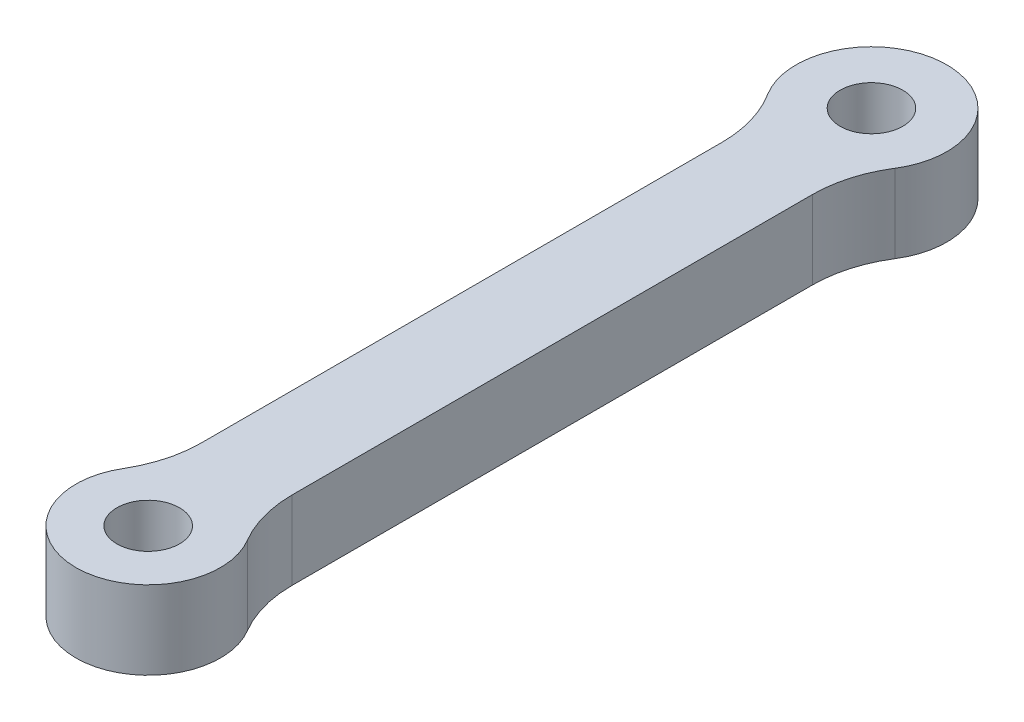
ISO-10303-21;
HEADER;
FILE_DESCRIPTION(('STEP AP214'),'2;1');
FILE_NAME('part.step','',(''),(''),'','','');
FILE_SCHEMA(('AUTOMOTIVE_DESIGN { 1 0 10303 214 1 1 1 1 }'));
ENDSEC;
DATA;
#1=APPLICATION_CONTEXT('core data for automotive mechanical design processes');
#2=APPLICATION_PROTOCOL_DEFINITION('international standard','automotive_design',2000,#1);
#3=PRODUCT_CONTEXT('',#1,'mechanical');
#4=PRODUCT('Part','Part','',(#3));
#5=PRODUCT_RELATED_PRODUCT_CATEGORY('part','',(#4));
#6=PRODUCT_DEFINITION_FORMATION('','',#4);
#7=PRODUCT_DEFINITION_CONTEXT('part definition',#1,'design');
#8=PRODUCT_DEFINITION('design','',#6,#7);
#9=PRODUCT_DEFINITION_SHAPE('','',#8);
#10=(LENGTH_UNIT() NAMED_UNIT(*) SI_UNIT(.MILLI.,.METRE.));
#11=(NAMED_UNIT(*) PLANE_ANGLE_UNIT() SI_UNIT($,.RADIAN.));
#12=(NAMED_UNIT(*) SI_UNIT($,.STERADIAN.) SOLID_ANGLE_UNIT());
#13=UNCERTAINTY_MEASURE_WITH_UNIT(LENGTH_MEASURE(1.E-05),#10,'distance_accuracy_value','');
#14=(GEOMETRIC_REPRESENTATION_CONTEXT(3) GLOBAL_UNCERTAINTY_ASSIGNED_CONTEXT((#13)) GLOBAL_UNIT_ASSIGNED_CONTEXT((#10,
#11,#12)) REPRESENTATION_CONTEXT('',''));
#15=CARTESIAN_POINT('',(0.,0.,0.));
#16=DIRECTION('',(0.,0.,1.));
#17=DIRECTION('',(1.,0.,0.));
#18=AXIS2_PLACEMENT_3D('',#15,#16,#17);
#19=CARTESIAN_POINT('',(3.75000000000001,6.5,0.));
#20=DIRECTION('',(1.,0.,0.));
#21=DIRECTION('',(0.,0.,-1.));
#22=AXIS2_PLACEMENT_3D('',#19,#20,#21);
#23=PLANE('',#22);
#24=DIRECTION('',(0.,0.,1.));
#25=VECTOR('',#24,1.);
#26=CARTESIAN_POINT('',(3.75000000000001,6.5,0.));
#27=LINE('',#26,#25);
#28=CARTESIAN_POINT('',(3.75,6.5,-51.3397459621556));
#29=VERTEX_POINT('',#28);
#30=CARTESIAN_POINT('',(3.75000000000001,6.5,-8.18153408597678));
#31=VERTEX_POINT('',#30);
#32=EDGE_CURVE('E205',#29,#31,#27,.T.);
#33=ORIENTED_EDGE('',*,*,#32,.T.);
#34=DIRECTION('',(0.,-1.,0.));
#35=VECTOR('',#34,1.);
#36=CARTESIAN_POINT('',(3.75000000000001,6.5,-8.18153408597678));
#37=LINE('',#36,#35);
#38=CARTESIAN_POINT('',(3.75000000000001,0.,-8.18153408597678));
#39=VERTEX_POINT('',#38);
#40=EDGE_CURVE('E137',#31,#39,#37,.T.);
#41=ORIENTED_EDGE('',*,*,#40,.T.);
#42=DIRECTION('',(0.,0.,1.));
#43=VECTOR('',#42,1.);
#44=CARTESIAN_POINT('',(3.75000000000001,0.,0.));
#45=LINE('',#44,#43);
#46=CARTESIAN_POINT('',(3.75,0.,-51.3397459621556));
#47=VERTEX_POINT('',#46);
#48=EDGE_CURVE('E153',#47,#39,#45,.T.);
#49=ORIENTED_EDGE('',*,*,#48,.F.);
#50=DIRECTION('',(0.,-1.,0.));
#51=VECTOR('',#50,1.);
#52=CARTESIAN_POINT('',(3.75,6.5,-51.3397459621556));
#53=LINE('',#52,#51);
#54=EDGE_CURVE('E82',#47,#29,#53,.F.);
#55=ORIENTED_EDGE('',*,*,#54,.T.);
#56=EDGE_LOOP('',(#33,#41,#49,#55));
#57=FACE_BOUND('',#56,.T.);
#58=ADVANCED_FACE('F60',(#57),#23,.T.);
#59=CARTESIAN_POINT('',(-3.75000000000001,6.5,0.));
#60=DIRECTION('',(1.,0.,0.));
#61=DIRECTION('',(0.,0.,-1.));
#62=AXIS2_PLACEMENT_3D('',#59,#60,#61);
#63=PLANE('',#62);
#64=DIRECTION('',(0.,0.,1.));
#65=VECTOR('',#64,1.);
#66=CARTESIAN_POINT('',(-3.75000000000001,0.,0.));
#67=LINE('',#66,#65);
#68=CARTESIAN_POINT('',(-3.75,0.,-51.3397459621556));
#69=VERTEX_POINT('',#68);
#70=CARTESIAN_POINT('',(-3.75000000000001,0.,-8.18153408597678));
#71=VERTEX_POINT('',#70);
#72=EDGE_CURVE('E154',#69,#71,#67,.T.);
#73=ORIENTED_EDGE('',*,*,#72,.T.);
#74=DIRECTION('',(0.,1.,0.));
#75=VECTOR('',#74,1.);
#76=CARTESIAN_POINT('',(-3.75000000000001,6.5,-8.18153408597678));
#77=LINE('',#76,#75);
#78=CARTESIAN_POINT('',(-3.75000000000001,6.5,-8.18153408597678));
#79=VERTEX_POINT('',#78);
#80=EDGE_CURVE('E131',#71,#79,#77,.T.);
#81=ORIENTED_EDGE('',*,*,#80,.T.);
#82=DIRECTION('',(0.,0.,1.));
#83=VECTOR('',#82,1.);
#84=CARTESIAN_POINT('',(-3.75000000000001,6.5,0.));
#85=LINE('',#84,#83);
#86=CARTESIAN_POINT('',(-3.75,6.5,-51.3397459621556));
#87=VERTEX_POINT('',#86);
#88=EDGE_CURVE('E164',#87,#79,#85,.T.);
#89=ORIENTED_EDGE('',*,*,#88,.F.);
#90=DIRECTION('',(0.,1.,0.));
#91=VECTOR('',#90,1.);
#92=CARTESIAN_POINT('',(-3.75,0.,-51.3397459621556));
#93=LINE('',#92,#91);
#94=EDGE_CURVE('E146',#87,#69,#93,.F.);
#95=ORIENTED_EDGE('',*,*,#94,.T.);
#96=EDGE_LOOP('',(#73,#81,#89,#95));
#97=FACE_BOUND('',#96,.T.);
#98=ADVANCED_FACE('F214',(#97),#63,.F.);
#99=CARTESIAN_POINT('',(0.,6.5,0.));
#100=DIRECTION('',(0.,-1.,0.));
#101=DIRECTION('',(0.,0.,-1.));
#102=AXIS2_PLACEMENT_3D('',#99,#100,#101);
#103=CYLINDRICAL_SURFACE('',#102,2.6);
#104=CARTESIAN_POINT('',(0.,6.5,0.));
#105=DIRECTION('',(0.,1.,0.));
#106=DIRECTION('',(0.,0.,1.));
#107=AXIS2_PLACEMENT_3D('',#104,#105,#106);
#108=CIRCLE('',#107,2.6);
#109=CARTESIAN_POINT('',(0.,6.5,-2.6));
#110=VERTEX_POINT('',#109);
#111=EDGE_CURVE('E176',#110,#110,#108,.T.);
#112=CARTESIAN_POINT('',(0.,0.,0.));
#113=DIRECTION('',(0.,1.,0.));
#114=DIRECTION('',(0.,0.,1.));
#115=AXIS2_PLACEMENT_3D('',#112,#113,#114);
#116=CIRCLE('',#115,2.6);
#117=CARTESIAN_POINT('',(0.,0.,-2.6));
#118=VERTEX_POINT('',#117);
#119=EDGE_CURVE('E156',#118,#118,#116,.T.);
#120=CARTESIAN_POINT('',(0.,6.5,-2.6));
#121=CARTESIAN_POINT('',(0.,6.43229166666667,-2.6));
#122=CARTESIAN_POINT('',(0.,6.36458333333333,-2.6));
#123=CARTESIAN_POINT('',(0.,6.22916666666667,-2.6));
#124=CARTESIAN_POINT('',(0.,6.16145833333333,-2.6));
#125=CARTESIAN_POINT('',(0.,6.02604166666667,-2.6));
#126=CARTESIAN_POINT('',(0.,5.95833333333333,-2.6));
#127=CARTESIAN_POINT('',(0.,5.82291666666667,-2.6));
#128=CARTESIAN_POINT('',(0.,5.75520833333333,-2.6));
#129=CARTESIAN_POINT('',(0.,5.61979166666667,-2.6));
#130=CARTESIAN_POINT('',(0.,5.55208333333333,-2.6));
#131=CARTESIAN_POINT('',(0.,5.41666666666667,-2.6));
#132=CARTESIAN_POINT('',(0.,5.34895833333333,-2.6));
#133=CARTESIAN_POINT('',(0.,5.21354166666667,-2.6));
#134=CARTESIAN_POINT('',(0.,5.14583333333333,-2.6));
#135=CARTESIAN_POINT('',(0.,5.01041666666667,-2.6));
#136=CARTESIAN_POINT('',(0.,4.94270833333333,-2.6));
#137=CARTESIAN_POINT('',(0.,4.80729166666667,-2.6));
#138=CARTESIAN_POINT('',(0.,4.73958333333333,-2.6));
#139=CARTESIAN_POINT('',(0.,4.60416666666667,-2.6));
#140=CARTESIAN_POINT('',(0.,4.53645833333333,-2.6));
#141=CARTESIAN_POINT('',(0.,4.40104166666667,-2.6));
#142=CARTESIAN_POINT('',(0.,4.33333333333333,-2.6));
#143=CARTESIAN_POINT('',(0.,4.19791666666667,-2.6));
#144=CARTESIAN_POINT('',(0.,4.13020833333333,-2.6));
#145=CARTESIAN_POINT('',(0.,3.99479166666667,-2.6));
#146=CARTESIAN_POINT('',(0.,3.92708333333333,-2.6));
#147=CARTESIAN_POINT('',(0.,3.79166666666667,-2.6));
#148=CARTESIAN_POINT('',(0.,3.72395833333333,-2.6));
#149=CARTESIAN_POINT('',(0.,3.58854166666667,-2.6));
#150=CARTESIAN_POINT('',(0.,3.52083333333333,-2.6));
#151=CARTESIAN_POINT('',(0.,3.38541666666667,-2.6));
#152=CARTESIAN_POINT('',(0.,3.31770833333333,-2.6));
#153=CARTESIAN_POINT('',(0.,3.18229166666667,-2.6));
#154=CARTESIAN_POINT('',(0.,3.11458333333333,-2.6));
#155=CARTESIAN_POINT('',(0.,2.97916666666667,-2.6));
#156=CARTESIAN_POINT('',(0.,2.91145833333333,-2.6));
#157=CARTESIAN_POINT('',(0.,2.77604166666667,-2.6));
#158=CARTESIAN_POINT('',(0.,2.70833333333333,-2.6));
#159=CARTESIAN_POINT('',(0.,2.57291666666667,-2.6));
#160=CARTESIAN_POINT('',(0.,2.50520833333333,-2.6));
#161=CARTESIAN_POINT('',(0.,2.36979166666667,-2.6));
#162=CARTESIAN_POINT('',(0.,2.30208333333333,-2.6));
#163=CARTESIAN_POINT('',(0.,2.16666666666667,-2.6));
#164=CARTESIAN_POINT('',(0.,2.09895833333333,-2.6));
#165=CARTESIAN_POINT('',(0.,1.96354166666667,-2.6));
#166=CARTESIAN_POINT('',(0.,1.89583333333333,-2.6));
#167=CARTESIAN_POINT('',(0.,1.76041666666667,-2.6));
#168=CARTESIAN_POINT('',(0.,1.69270833333333,-2.6));
#169=CARTESIAN_POINT('',(0.,1.55729166666667,-2.6));
#170=CARTESIAN_POINT('',(0.,1.48958333333333,-2.6));
#171=CARTESIAN_POINT('',(0.,1.35416666666667,-2.6));
#172=CARTESIAN_POINT('',(0.,1.28645833333333,-2.6));
#173=CARTESIAN_POINT('',(0.,1.15104166666667,-2.6));
#174=CARTESIAN_POINT('',(0.,1.08333333333333,-2.6));
#175=CARTESIAN_POINT('',(0.,0.947916666666667,-2.6));
#176=CARTESIAN_POINT('',(0.,0.880208333333333,-2.6));
#177=CARTESIAN_POINT('',(0.,0.744791666666667,-2.6));
#178=CARTESIAN_POINT('',(0.,0.677083333333333,-2.6));
#179=CARTESIAN_POINT('',(0.,0.541666666666667,-2.6));
#180=CARTESIAN_POINT('',(0.,0.473958333333333,-2.6));
#181=CARTESIAN_POINT('',(0.,0.338541666666667,-2.6));
#182=CARTESIAN_POINT('',(0.,0.270833333333334,-2.6));
#183=CARTESIAN_POINT('',(0.,0.135416666666667,-2.6));
#184=CARTESIAN_POINT('',(0.,0.0677083333333334,-2.6));
#185=CARTESIAN_POINT('',(0.,0.,-2.6));
#186=B_SPLINE_CURVE_WITH_KNOTS('',3,(#120,#121,#122,#123,#124,#125,#126,#127,#128,#129,#130,
#131,#132,#133,#134,#135,#136,#137,#138,#139,#140,#141,#142,#143,#144,#145,#146,#147,#148,#149,
#150,#151,#152,#153,#154,#155,#156,#157,#158,#159,#160,#161,#162,#163,#164,#165,#166,#167,#168,
#169,#170,#171,#172,#173,#174,#175,#176,#177,#178,#179,#180,#181,#182,#183,#184,#185),
.UNSPECIFIED.,.F.,.F.,(4,2,2,2,2,2,2,2,2,2,2,2,2,2,2,2,2,2,2,2,2,2,2,2,2,2,2,2,2,2,2,2,4),(0.,
0.203124999999999,0.40625,0.609375,0.812499999999999,1.015625,1.21875,1.421875,1.625,1.828125,
2.03125,2.234375,2.4375,2.640625,2.84375,3.046875,3.25,3.453125,3.65625,3.859375,4.0625,
4.265625,4.46875,4.671875,4.875,5.078125,5.28125,5.484375,5.6875,5.890625,6.09375,6.296875,6.5),.UNSPECIFIED.);
#187=EDGE_CURVE('BSEAM221',#110,#118,#186,.T.);
#188=ORIENTED_EDGE('',*,*,#111,.T.);
#189=ORIENTED_EDGE('',*,*,#119,.F.);
#190=ORIENTED_EDGE('',*,*,#187,.T.);
#191=ORIENTED_EDGE('',*,*,#187,.F.);
#192=EDGE_LOOP('',(#188,#190,#189,#191));
#193=FACE_BOUND('',#192,.T.);
#194=ADVANCED_FACE('F221',(#193),#103,.F.);
#195=CARTESIAN_POINT('',(0.,6.5,0.));
#196=DIRECTION('',(0.,-1.,0.));
#197=DIRECTION('',(0.,0.,-1.));
#198=AXIS2_PLACEMENT_3D('',#195,#196,#197);
#199=CYLINDRICAL_SURFACE('',#198,6.);
#200=CARTESIAN_POINT('',(0.,6.5,0.));
#201=DIRECTION('',(0.,1.,0.));
#202=DIRECTION('',(0.,0.,1.));
#203=AXIS2_PLACEMENT_3D('',#200,#201,#202);
#204=CIRCLE('',#203,6.);
#205=CARTESIAN_POINT('',(-5.15625,6.5,-3.06807528224129));
#206=VERTEX_POINT('',#205);
#207=CARTESIAN_POINT('',(5.15625,6.5,-3.06807528224129));
#208=VERTEX_POINT('',#207);
#209=EDGE_CURVE('E145',#206,#208,#204,.T.);
#210=ORIENTED_EDGE('',*,*,#209,.F.);
#211=DIRECTION('',(0.,-1.,0.));
#212=VECTOR('',#211,1.);
#213=CARTESIAN_POINT('',(-5.15625,6.5,-3.06807528224129));
#214=LINE('',#213,#212);
#215=CARTESIAN_POINT('',(-5.15625,0.,-3.06807528224129));
#216=VERTEX_POINT('',#215);
#217=EDGE_CURVE('E130',#206,#216,#214,.T.);
#218=ORIENTED_EDGE('',*,*,#217,.T.);
#219=CARTESIAN_POINT('',(0.,0.,0.));
#220=DIRECTION('',(0.,1.,0.));
#221=DIRECTION('',(0.,0.,1.));
#222=AXIS2_PLACEMENT_3D('',#219,#220,#221);
#223=CIRCLE('',#222,6.);
#224=CARTESIAN_POINT('',(5.15625,0.,-3.06807528224129));
#225=VERTEX_POINT('',#224);
#226=EDGE_CURVE('E143',#216,#225,#223,.T.);
#227=ORIENTED_EDGE('',*,*,#226,.T.);
#228=DIRECTION('',(0.,-1.,0.));
#229=VECTOR('',#228,1.);
#230=CARTESIAN_POINT('',(5.15625,6.5,-3.06807528224129));
#231=LINE('',#230,#229);
#232=EDGE_CURVE('E147',#225,#208,#231,.F.);
#233=ORIENTED_EDGE('',*,*,#232,.T.);
#234=EDGE_LOOP('',(#210,#218,#227,#233));
#235=FACE_BOUND('',#234,.T.);
#236=ADVANCED_FACE('F142',(#235),#199,.T.);
#237=CARTESIAN_POINT('',(0.,0.,0.));
#238=DIRECTION('',(0.,1.,0.));
#239=DIRECTION('',(0.,0.,1.));
#240=AXIS2_PLACEMENT_3D('',#237,#238,#239);
#241=PLANE('',#240);
#242=ORIENTED_EDGE('',*,*,#226,.F.);
#243=CARTESIAN_POINT('',(-13.75,0.,-8.18153408597678));
#244=DIRECTION('',(0.,1.,0.));
#245=DIRECTION('',(0.,0.,1.));
#246=AXIS2_PLACEMENT_3D('',#243,#244,#245);
#247=CIRCLE('',#246,10.);
#248=EDGE_CURVE('E126',#216,#71,#247,.T.);
#249=ORIENTED_EDGE('',*,*,#248,.T.);
#250=ORIENTED_EDGE('',*,*,#72,.F.);
#251=CARTESIAN_POINT('',(-13.75,0.,-51.3397459621556));
#252=DIRECTION('',(0.,1.,0.));
#253=DIRECTION('',(0.,0.,1.));
#254=AXIS2_PLACEMENT_3D('',#251,#252,#253);
#255=CIRCLE('',#254,10.);
#256=CARTESIAN_POINT('',(-5.28846153846154,0.,-56.6691330623675));
#257=VERTEX_POINT('',#256);
#258=EDGE_CURVE('E190',#69,#257,#255,.T.);
#259=ORIENTED_EDGE('',*,*,#258,.T.);
#260=CARTESIAN_POINT('',(0.,0.,-60.));
#261=DIRECTION('',(0.,1.,0.));
#262=DIRECTION('',(0.,0.,1.));
#263=AXIS2_PLACEMENT_3D('',#260,#261,#262);
#264=CIRCLE('',#263,6.25);
#265=CARTESIAN_POINT('',(5.28846153846154,0.,-56.6691330623675));
#266=VERTEX_POINT('',#265);
#267=EDGE_CURVE('E168',#266,#257,#264,.T.);
#268=ORIENTED_EDGE('',*,*,#267,.F.);
#269=CARTESIAN_POINT('',(13.75,0.,-51.3397459621556));
#270=DIRECTION('',(0.,1.,0.));
#271=DIRECTION('',(0.,0.,1.));
#272=AXIS2_PLACEMENT_3D('',#269,#270,#271);
#273=CIRCLE('',#272,10.);
#274=EDGE_CURVE('E68',#266,#47,#273,.T.);
#275=ORIENTED_EDGE('',*,*,#274,.T.);
#276=ORIENTED_EDGE('',*,*,#48,.T.);
#277=CARTESIAN_POINT('',(13.75,0.,-8.18153408597678));
#278=DIRECTION('',(0.,1.,0.));
#279=DIRECTION('',(0.,0.,1.));
#280=AXIS2_PLACEMENT_3D('',#277,#278,#279);
#281=CIRCLE('',#280,10.);
#282=EDGE_CURVE('E152',#39,#225,#281,.T.);
#283=ORIENTED_EDGE('',*,*,#282,.T.);
#284=EDGE_LOOP('',(#242,#249,#250,#259,#268,#275,#276,#283));
#285=FACE_BOUND('',#284,.T.);
#286=ORIENTED_EDGE('',*,*,#119,.T.);
#287=EDGE_LOOP('',(#286));
#288=FACE_BOUND('',#287,.T.);
#289=CARTESIAN_POINT('',(0.,0.,-60.));
#290=DIRECTION('',(0.,1.,0.));
#291=DIRECTION('',(0.,0.,1.));
#292=AXIS2_PLACEMENT_3D('',#289,#290,#291);
#293=CIRCLE('',#292,2.6);
#294=CARTESIAN_POINT('',(0.,0.,-62.6));
#295=VERTEX_POINT('',#294);
#296=EDGE_CURVE('E171',#295,#295,#293,.T.);
#297=ORIENTED_EDGE('',*,*,#296,.T.);
#298=EDGE_LOOP('',(#297));
#299=FACE_BOUND('',#298,.T.);
#300=ADVANCED_FACE('F149',(#285,#288,#299),#241,.F.);
#301=CARTESIAN_POINT('',(0.,6.5,0.));
#302=DIRECTION('',(0.,1.,0.));
#303=DIRECTION('',(0.,0.,1.));
#304=AXIS2_PLACEMENT_3D('',#301,#302,#303);
#305=PLANE('',#304);
#306=ORIENTED_EDGE('',*,*,#88,.T.);
#307=CARTESIAN_POINT('',(-13.75,6.5,-8.18153408597678));
#308=DIRECTION('',(0.,1.,0.));
#309=DIRECTION('',(0.,0.,1.));
#310=AXIS2_PLACEMENT_3D('',#307,#308,#309);
#311=CIRCLE('',#310,10.);
#312=EDGE_CURVE('E136',#79,#206,#311,.F.);
#313=ORIENTED_EDGE('',*,*,#312,.T.);
#314=ORIENTED_EDGE('',*,*,#209,.T.);
#315=CARTESIAN_POINT('',(13.75,6.5,-8.18153408597678));
#316=DIRECTION('',(0.,1.,0.));
#317=DIRECTION('',(0.,0.,1.));
#318=AXIS2_PLACEMENT_3D('',#315,#316,#317);
#319=CIRCLE('',#318,10.);
#320=EDGE_CURVE('E75',#208,#31,#319,.F.);
#321=ORIENTED_EDGE('',*,*,#320,.T.);
#322=ORIENTED_EDGE('',*,*,#32,.F.);
#323=CARTESIAN_POINT('',(13.75,6.5,-51.3397459621556));
#324=DIRECTION('',(0.,1.,0.));
#325=DIRECTION('',(0.,0.,1.));
#326=AXIS2_PLACEMENT_3D('',#323,#324,#325);
#327=CIRCLE('',#326,10.);
#328=CARTESIAN_POINT('',(5.28846153846154,6.5,-56.6691330623675));
#329=VERTEX_POINT('',#328);
#330=EDGE_CURVE('E12',#29,#329,#327,.F.);
#331=ORIENTED_EDGE('',*,*,#330,.T.);
#332=CARTESIAN_POINT('',(0.,6.5,-60.));
#333=DIRECTION('',(0.,1.,0.));
#334=DIRECTION('',(0.,0.,1.));
#335=AXIS2_PLACEMENT_3D('',#332,#333,#334);
#336=CIRCLE('',#335,6.25);
#337=CARTESIAN_POINT('',(-5.28846153846154,6.5,-56.6691330623675));
#338=VERTEX_POINT('',#337);
#339=EDGE_CURVE('E158',#329,#338,#336,.T.);
#340=ORIENTED_EDGE('',*,*,#339,.T.);
#341=CARTESIAN_POINT('',(-13.75,6.5,-51.3397459621556));
#342=DIRECTION('',(0.,1.,0.));
#343=DIRECTION('',(0.,0.,1.));
#344=AXIS2_PLACEMENT_3D('',#341,#342,#343);
#345=CIRCLE('',#344,10.);
#346=EDGE_CURVE('E192',#338,#87,#345,.F.);
#347=ORIENTED_EDGE('',*,*,#346,.T.);
#348=EDGE_LOOP('',(#306,#313,#314,#321,#322,#331,#340,#347));
#349=FACE_BOUND('',#348,.T.);
#350=ORIENTED_EDGE('',*,*,#111,.F.);
#351=EDGE_LOOP('',(#350));
#352=FACE_BOUND('',#351,.T.);
#353=CARTESIAN_POINT('',(0.,6.5,-60.));
#354=DIRECTION('',(0.,1.,0.));
#355=DIRECTION('',(0.,0.,1.));
#356=AXIS2_PLACEMENT_3D('',#353,#354,#355);
#357=CIRCLE('',#356,2.6);
#358=CARTESIAN_POINT('',(0.,6.5,-62.6));
#359=VERTEX_POINT('',#358);
#360=EDGE_CURVE('E165',#359,#359,#357,.T.);
#361=ORIENTED_EDGE('',*,*,#360,.F.);
#362=EDGE_LOOP('',(#361));
#363=FACE_BOUND('',#362,.T.);
#364=ADVANCED_FACE('F202',(#349,#352,#363),#305,.T.);
#365=CARTESIAN_POINT('',(0.,6.5,-60.));
#366=DIRECTION('',(0.,-1.,0.));
#367=DIRECTION('',(0.,0.,-1.));
#368=AXIS2_PLACEMENT_3D('',#365,#366,#367);
#369=CYLINDRICAL_SURFACE('',#368,2.6);
#370=CARTESIAN_POINT('',(0.,6.5,-62.6));
#371=CARTESIAN_POINT('',(0.,6.43229166666667,-62.6));
#372=CARTESIAN_POINT('',(0.,6.36458333333333,-62.6));
#373=CARTESIAN_POINT('',(0.,6.22916666666667,-62.6));
#374=CARTESIAN_POINT('',(0.,6.16145833333333,-62.6));
#375=CARTESIAN_POINT('',(0.,6.02604166666667,-62.6));
#376=CARTESIAN_POINT('',(0.,5.95833333333333,-62.6));
#377=CARTESIAN_POINT('',(0.,5.82291666666667,-62.6));
#378=CARTESIAN_POINT('',(0.,5.75520833333333,-62.6));
#379=CARTESIAN_POINT('',(0.,5.61979166666667,-62.6));
#380=CARTESIAN_POINT('',(0.,5.55208333333333,-62.6));
#381=CARTESIAN_POINT('',(0.,5.41666666666667,-62.6));
#382=CARTESIAN_POINT('',(0.,5.34895833333333,-62.6));
#383=CARTESIAN_POINT('',(0.,5.21354166666667,-62.6));
#384=CARTESIAN_POINT('',(0.,5.14583333333333,-62.6));
#385=CARTESIAN_POINT('',(0.,5.01041666666667,-62.6));
#386=CARTESIAN_POINT('',(0.,4.94270833333333,-62.6));
#387=CARTESIAN_POINT('',(0.,4.80729166666667,-62.6));
#388=CARTESIAN_POINT('',(0.,4.73958333333333,-62.6));
#389=CARTESIAN_POINT('',(0.,4.60416666666667,-62.6));
#390=CARTESIAN_POINT('',(0.,4.53645833333333,-62.6));
#391=CARTESIAN_POINT('',(0.,4.40104166666667,-62.6));
#392=CARTESIAN_POINT('',(0.,4.33333333333333,-62.6));
#393=CARTESIAN_POINT('',(0.,4.19791666666667,-62.6));
#394=CARTESIAN_POINT('',(0.,4.13020833333333,-62.6));
#395=CARTESIAN_POINT('',(0.,3.99479166666667,-62.6));
#396=CARTESIAN_POINT('',(0.,3.92708333333333,-62.6));
#397=CARTESIAN_POINT('',(0.,3.79166666666667,-62.6));
#398=CARTESIAN_POINT('',(0.,3.72395833333333,-62.6));
#399=CARTESIAN_POINT('',(0.,3.58854166666667,-62.6));
#400=CARTESIAN_POINT('',(0.,3.52083333333333,-62.6));
#401=CARTESIAN_POINT('',(0.,3.38541666666667,-62.6));
#402=CARTESIAN_POINT('',(0.,3.31770833333333,-62.6));
#403=CARTESIAN_POINT('',(0.,3.18229166666667,-62.6));
#404=CARTESIAN_POINT('',(0.,3.11458333333333,-62.6));
#405=CARTESIAN_POINT('',(0.,2.97916666666667,-62.6));
#406=CARTESIAN_POINT('',(0.,2.91145833333333,-62.6));
#407=CARTESIAN_POINT('',(0.,2.77604166666667,-62.6));
#408=CARTESIAN_POINT('',(0.,2.70833333333333,-62.6));
#409=CARTESIAN_POINT('',(0.,2.57291666666667,-62.6));
#410=CARTESIAN_POINT('',(0.,2.50520833333333,-62.6));
#411=CARTESIAN_POINT('',(0.,2.36979166666667,-62.6));
#412=CARTESIAN_POINT('',(0.,2.30208333333333,-62.6));
#413=CARTESIAN_POINT('',(0.,2.16666666666667,-62.6));
#414=CARTESIAN_POINT('',(0.,2.09895833333333,-62.6));
#415=CARTESIAN_POINT('',(0.,1.96354166666667,-62.6));
#416=CARTESIAN_POINT('',(0.,1.89583333333333,-62.6));
#417=CARTESIAN_POINT('',(0.,1.76041666666667,-62.6));
#418=CARTESIAN_POINT('',(0.,1.69270833333333,-62.6));
#419=CARTESIAN_POINT('',(0.,1.55729166666667,-62.6));
#420=CARTESIAN_POINT('',(0.,1.48958333333333,-62.6));
#421=CARTESIAN_POINT('',(0.,1.35416666666667,-62.6));
#422=CARTESIAN_POINT('',(0.,1.28645833333333,-62.6));
#423=CARTESIAN_POINT('',(0.,1.15104166666667,-62.6));
#424=CARTESIAN_POINT('',(0.,1.08333333333333,-62.6));
#425=CARTESIAN_POINT('',(0.,0.947916666666667,-62.6));
#426=CARTESIAN_POINT('',(0.,0.880208333333333,-62.6));
#427=CARTESIAN_POINT('',(0.,0.744791666666667,-62.6));
#428=CARTESIAN_POINT('',(0.,0.677083333333333,-62.6));
#429=CARTESIAN_POINT('',(0.,0.541666666666667,-62.6));
#430=CARTESIAN_POINT('',(0.,0.473958333333333,-62.6));
#431=CARTESIAN_POINT('',(0.,0.338541666666667,-62.6));
#432=CARTESIAN_POINT('',(0.,0.270833333333334,-62.6));
#433=CARTESIAN_POINT('',(0.,0.135416666666667,-62.6));
#434=CARTESIAN_POINT('',(0.,0.0677083333333334,-62.6));
#435=CARTESIAN_POINT('',(0.,0.,-62.6));
#436=B_SPLINE_CURVE_WITH_KNOTS('',3,(#370,#371,#372,#373,#374,#375,#376,#377,#378,#379,#380,
#381,#382,#383,#384,#385,#386,#387,#388,#389,#390,#391,#392,#393,#394,#395,#396,#397,#398,#399,
#400,#401,#402,#403,#404,#405,#406,#407,#408,#409,#410,#411,#412,#413,#414,#415,#416,#417,#418,
#419,#420,#421,#422,#423,#424,#425,#426,#427,#428,#429,#430,#431,#432,#433,#434,#435),
.UNSPECIFIED.,.F.,.F.,(4,2,2,2,2,2,2,2,2,2,2,2,2,2,2,2,2,2,2,2,2,2,2,2,2,2,2,2,2,2,2,2,4),(0.,
0.203124999999999,0.40625,0.609375,0.812499999999999,1.015625,1.21875,1.421875,1.625,1.828125,
2.03125,2.234375,2.4375,2.640625,2.84375,3.046875,3.25,3.453125,3.65625,3.859375,4.0625,
4.265625,4.46875,4.671875,4.875,5.078125,5.28125,5.484375,5.6875,5.890625,6.09375,6.296875,6.5),.UNSPECIFIED.);
#437=EDGE_CURVE('BSEAM225',#359,#295,#436,.T.);
#438=ORIENTED_EDGE('',*,*,#360,.T.);
#439=ORIENTED_EDGE('',*,*,#296,.F.);
#440=ORIENTED_EDGE('',*,*,#437,.T.);
#441=ORIENTED_EDGE('',*,*,#437,.F.);
#442=EDGE_LOOP('',(#438,#440,#439,#441));
#443=FACE_BOUND('',#442,.T.);
#444=ADVANCED_FACE('F225',(#443),#369,.F.);
#445=CARTESIAN_POINT('',(0.,6.5,-60.));
#446=DIRECTION('',(0.,-1.,0.));
#447=DIRECTION('',(0.,0.,-1.));
#448=AXIS2_PLACEMENT_3D('',#445,#446,#447);
#449=CYLINDRICAL_SURFACE('',#448,6.25);
#450=ORIENTED_EDGE('',*,*,#267,.T.);
#451=DIRECTION('',(0.,-1.,0.));
#452=VECTOR('',#451,1.);
#453=CARTESIAN_POINT('',(-5.28846153846154,6.5,-56.6691330623675));
#454=LINE('',#453,#452);
#455=EDGE_CURVE('E184',#257,#338,#454,.F.);
#456=ORIENTED_EDGE('',*,*,#455,.T.);
#457=ORIENTED_EDGE('',*,*,#339,.F.);
#458=DIRECTION('',(0.,-1.,0.));
#459=VECTOR('',#458,1.);
#460=CARTESIAN_POINT('',(5.28846153846154,6.5,-56.6691330623675));
#461=LINE('',#460,#459);
#462=EDGE_CURVE('E181',#329,#266,#461,.T.);
#463=ORIENTED_EDGE('',*,*,#462,.T.);
#464=EDGE_LOOP('',(#450,#456,#457,#463));
#465=FACE_BOUND('',#464,.T.);
#466=ADVANCED_FACE('F207',(#465),#449,.T.);
#467=CARTESIAN_POINT('',(-13.75,6.5,-8.18153408597678));
#468=DIRECTION('',(0.,-1.,0.));
#469=DIRECTION('',(0.,0.,-1.));
#470=AXIS2_PLACEMENT_3D('',#467,#468,#469);
#471=CYLINDRICAL_SURFACE('',#470,10.);
#472=ORIENTED_EDGE('',*,*,#312,.F.);
#473=ORIENTED_EDGE('',*,*,#80,.F.);
#474=ORIENTED_EDGE('',*,*,#248,.F.);
#475=ORIENTED_EDGE('',*,*,#217,.F.);
#476=EDGE_LOOP('',(#472,#473,#474,#475));
#477=FACE_BOUND('',#476,.T.);
#478=ADVANCED_FACE('F129',(#477),#471,.F.);
#479=CARTESIAN_POINT('',(-13.75,6.5,-51.3397459621556));
#480=DIRECTION('',(0.,-1.,0.));
#481=DIRECTION('',(0.,0.,-1.));
#482=AXIS2_PLACEMENT_3D('',#479,#480,#481);
#483=CYLINDRICAL_SURFACE('',#482,10.);
#484=ORIENTED_EDGE('',*,*,#346,.F.);
#485=ORIENTED_EDGE('',*,*,#455,.F.);
#486=ORIENTED_EDGE('',*,*,#258,.F.);
#487=ORIENTED_EDGE('',*,*,#94,.F.);
#488=EDGE_LOOP('',(#484,#485,#486,#487));
#489=FACE_BOUND('',#488,.T.);
#490=ADVANCED_FACE('F210',(#489),#483,.F.);
#491=CARTESIAN_POINT('',(13.75,6.5,-8.18153408597678));
#492=DIRECTION('',(0.,-1.,0.));
#493=DIRECTION('',(0.,0.,-1.));
#494=AXIS2_PLACEMENT_3D('',#491,#492,#493);
#495=CYLINDRICAL_SURFACE('',#494,10.);
#496=ORIENTED_EDGE('',*,*,#320,.F.);
#497=ORIENTED_EDGE('',*,*,#232,.F.);
#498=ORIENTED_EDGE('',*,*,#282,.F.);
#499=ORIENTED_EDGE('',*,*,#40,.F.);
#500=EDGE_LOOP('',(#496,#497,#498,#499));
#501=FACE_BOUND('',#500,.T.);
#502=ADVANCED_FACE('F254',(#501),#495,.F.);
#503=CARTESIAN_POINT('',(13.75,6.5,-51.3397459621556));
#504=DIRECTION('',(0.,-1.,0.));
#505=DIRECTION('',(0.,0.,-1.));
#506=AXIS2_PLACEMENT_3D('',#503,#504,#505);
#507=CYLINDRICAL_SURFACE('',#506,10.);
#508=ORIENTED_EDGE('',*,*,#330,.F.);
#509=ORIENTED_EDGE('',*,*,#54,.F.);
#510=ORIENTED_EDGE('',*,*,#274,.F.);
#511=ORIENTED_EDGE('',*,*,#462,.F.);
#512=EDGE_LOOP('',(#508,#509,#510,#511));
#513=FACE_BOUND('',#512,.T.);
#514=ADVANCED_FACE('F62',(#513),#507,.F.);
#515=CLOSED_SHELL('',(#58,#98,#194,#236,#300,#364,#444,#466,#478,#490,#502,#514));
#516=MANIFOLD_SOLID_BREP('B2',#515);
#517=ADVANCED_BREP_SHAPE_REPRESENTATION('',(#18,#516),#14);
#518=SHAPE_DEFINITION_REPRESENTATION(#9,#517);
ENDSEC;
END-ISO-10303-21;
